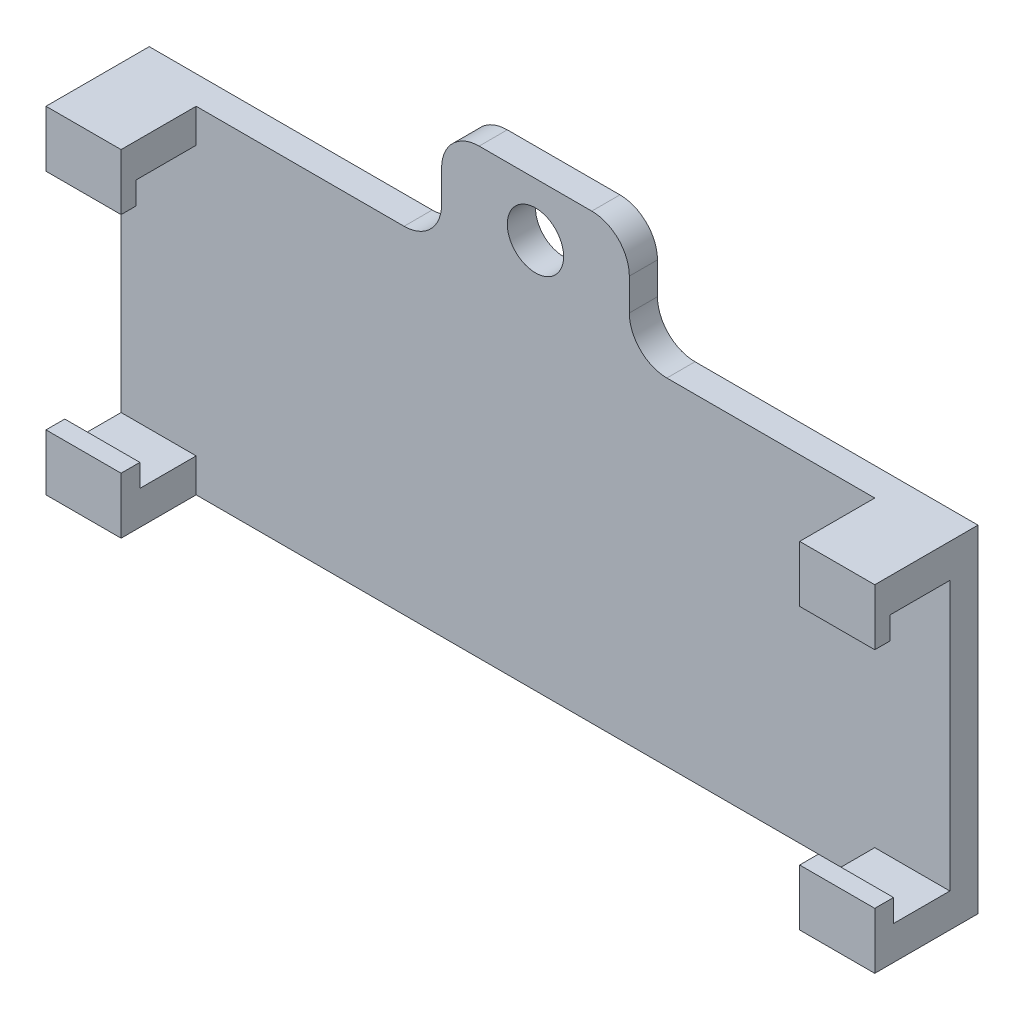
ISO-10303-21;
HEADER;
FILE_DESCRIPTION(('STEP AP214'),'2;1');
FILE_NAME('part.step','',(''),(''),'','','');
FILE_SCHEMA(('AUTOMOTIVE_DESIGN { 1 0 10303 214 1 1 1 1 }'));
ENDSEC;
DATA;
#1=APPLICATION_CONTEXT('core data for automotive mechanical design processes');
#2=APPLICATION_PROTOCOL_DEFINITION('international standard','automotive_design',2000,#1);
#3=PRODUCT_CONTEXT('',#1,'mechanical');
#4=PRODUCT('Part','Part','',(#3));
#5=PRODUCT_RELATED_PRODUCT_CATEGORY('part','',(#4));
#6=PRODUCT_DEFINITION_FORMATION('','',#4);
#7=PRODUCT_DEFINITION_CONTEXT('part definition',#1,'design');
#8=PRODUCT_DEFINITION('design','',#6,#7);
#9=PRODUCT_DEFINITION_SHAPE('','',#8);
#10=(LENGTH_UNIT() NAMED_UNIT(*) SI_UNIT(.MILLI.,.METRE.));
#11=(NAMED_UNIT(*) PLANE_ANGLE_UNIT() SI_UNIT($,.RADIAN.));
#12=(NAMED_UNIT(*) SI_UNIT($,.STERADIAN.) SOLID_ANGLE_UNIT());
#13=UNCERTAINTY_MEASURE_WITH_UNIT(LENGTH_MEASURE(1.E-05),#10,'distance_accuracy_value','');
#14=(GEOMETRIC_REPRESENTATION_CONTEXT(3) GLOBAL_UNCERTAINTY_ASSIGNED_CONTEXT((#13)) GLOBAL_UNIT_ASSIGNED_CONTEXT((#10,
#11,#12)) REPRESENTATION_CONTEXT('',''));
#15=CARTESIAN_POINT('',(0.,0.,0.));
#16=DIRECTION('',(0.,0.,1.));
#17=DIRECTION('',(1.,0.,0.));
#18=AXIS2_PLACEMENT_3D('',#15,#16,#17);
#19=CARTESIAN_POINT('',(0.,2.67999999999999,-17.95));
#20=DIRECTION('',(0.,1.,0.));
#21=DIRECTION('',(-1.,0.,0.));
#22=AXIS2_PLACEMENT_3D('',#19,#20,#21);
#23=PLANE('',#22);
#24=DIRECTION('',(-1.,0.,0.));
#25=VECTOR('',#24,1.);
#26=CARTESIAN_POINT('',(0.,2.67999999999999,-18.75));
#27=LINE('',#26,#25);
#28=CARTESIAN_POINT('',(4.,2.67999999999999,-18.75));
#29=VERTEX_POINT('',#28);
#30=CARTESIAN_POINT('',(0.,2.67999999999999,-18.75));
#31=VERTEX_POINT('',#30);
#32=EDGE_CURVE('E445',#29,#31,#27,.T.);
#33=ORIENTED_EDGE('',*,*,#32,.F.);
#34=DIRECTION('',(0.,0.,1.));
#35=VECTOR('',#34,1.);
#36=CARTESIAN_POINT('',(4.,2.67999999999999,-17.95));
#37=LINE('',#36,#35);
#38=CARTESIAN_POINT('',(4.,2.67999999999999,-17.95));
#39=VERTEX_POINT('',#38);
#40=EDGE_CURVE('E411',#29,#39,#37,.T.);
#41=ORIENTED_EDGE('',*,*,#40,.T.);
#42=DIRECTION('',(1.,0.,0.));
#43=VECTOR('',#42,1.);
#44=CARTESIAN_POINT('',(0.,2.67999999999999,-17.95));
#45=LINE('',#44,#43);
#46=CARTESIAN_POINT('',(0.,2.67999999999999,-17.95));
#47=VERTEX_POINT('',#46);
#48=EDGE_CURVE('E493',#47,#39,#45,.T.);
#49=ORIENTED_EDGE('',*,*,#48,.F.);
#50=DIRECTION('',(0.,0.,-1.));
#51=VECTOR('',#50,1.);
#52=CARTESIAN_POINT('',(0.,2.67999999999999,-17.95));
#53=LINE('',#52,#51);
#54=EDGE_CURVE('E281',#47,#31,#53,.T.);
#55=ORIENTED_EDGE('',*,*,#54,.T.);
#56=EDGE_LOOP('',(#33,#41,#49,#55));
#57=FACE_BOUND('',#56,.T.);
#58=ADVANCED_FACE('F39',(#57),#23,.F.);
#59=CARTESIAN_POINT('',(0.,5.67999999999999,-17.95));
#60=DIRECTION('',(0.,-1.,0.));
#61=DIRECTION('',(1.,0.,0.));
#62=AXIS2_PLACEMENT_3D('',#59,#60,#61);
#63=PLANE('',#62);
#64=DIRECTION('',(1.,0.,0.));
#65=VECTOR('',#64,1.);
#66=CARTESIAN_POINT('',(0.,5.68,-21.95));
#67=LINE('',#66,#65);
#68=CARTESIAN_POINT('',(4.,5.68,-21.95));
#69=VERTEX_POINT('',#68);
#70=CARTESIAN_POINT('',(15.075,5.68,-21.95));
#71=VERTEX_POINT('',#70);
#72=EDGE_CURVE('E353',#69,#71,#67,.T.);
#73=ORIENTED_EDGE('',*,*,#72,.T.);
#74=DIRECTION('',(0.,0.,1.));
#75=VECTOR('',#74,1.);
#76=CARTESIAN_POINT('',(15.075,5.68000000000001,-23.45));
#77=LINE('',#76,#75);
#78=CARTESIAN_POINT('',(15.075,5.68000000000001,-23.45));
#79=VERTEX_POINT('',#78);
#80=EDGE_CURVE('E268',#71,#79,#77,.F.);
#81=ORIENTED_EDGE('',*,*,#80,.T.);
#82=DIRECTION('',(1.,0.,0.));
#83=VECTOR('',#82,1.);
#84=CARTESIAN_POINT('',(0.,5.68000000000001,-23.45));
#85=LINE('',#84,#83);
#86=CARTESIAN_POINT('',(0.,5.68000000000001,-23.45));
#87=VERTEX_POINT('',#86);
#88=EDGE_CURVE('E264',#87,#79,#85,.T.);
#89=ORIENTED_EDGE('',*,*,#88,.F.);
#90=DIRECTION('',(0.,0.,-1.));
#91=VECTOR('',#90,1.);
#92=CARTESIAN_POINT('',(0.,5.67999999999999,-17.95));
#93=LINE('',#92,#91);
#94=CARTESIAN_POINT('',(0.,5.67999999999999,-17.95));
#95=VERTEX_POINT('',#94);
#96=EDGE_CURVE('E248',#95,#87,#93,.T.);
#97=ORIENTED_EDGE('',*,*,#96,.F.);
#98=DIRECTION('',(-1.,0.,0.));
#99=VECTOR('',#98,1.);
#100=CARTESIAN_POINT('',(0.,5.67999999999999,-17.95));
#101=LINE('',#100,#99);
#102=CARTESIAN_POINT('',(4.,5.67999999999999,-17.95));
#103=VERTEX_POINT('',#102);
#104=EDGE_CURVE('E498',#103,#95,#101,.T.);
#105=ORIENTED_EDGE('',*,*,#104,.F.);
#106=DIRECTION('',(0.,0.,-1.));
#107=VECTOR('',#106,1.);
#108=CARTESIAN_POINT('',(4.,5.67999999999999,-17.95));
#109=LINE('',#108,#107);
#110=EDGE_CURVE('E414',#103,#69,#109,.T.);
#111=ORIENTED_EDGE('',*,*,#110,.T.);
#112=EDGE_LOOP('',(#73,#81,#89,#97,#105,#111));
#113=FACE_BOUND('',#112,.T.);
#114=ADVANCED_FACE('F266',(#113),#63,.F.);
#115=CARTESIAN_POINT('',(0.,-17.95,-17.9500000000001));
#116=DIRECTION('',(0.,0.,-1.));
#117=DIRECTION('',(0.,1.,0.));
#118=AXIS2_PLACEMENT_3D('',#115,#116,#117);
#119=PLANE('',#118);
#120=ORIENTED_EDGE('',*,*,#48,.T.);
#121=DIRECTION('',(0.,-1.,0.));
#122=VECTOR('',#121,1.);
#123=CARTESIAN_POINT('',(4.,11.38,-17.95));
#124=LINE('',#123,#122);
#125=EDGE_CURVE('E372',#103,#39,#124,.T.);
#126=ORIENTED_EDGE('',*,*,#125,.F.);
#127=ORIENTED_EDGE('',*,*,#104,.T.);
#128=DIRECTION('',(0.,-1.,0.));
#129=VECTOR('',#128,1.);
#130=CARTESIAN_POINT('',(0.,2.67999999999999,-17.95));
#131=LINE('',#130,#129);
#132=EDGE_CURVE('E257',#95,#47,#131,.T.);
#133=ORIENTED_EDGE('',*,*,#132,.T.);
#134=EDGE_LOOP('',(#120,#126,#127,#133));
#135=FACE_BOUND('',#134,.T.);
#136=ADVANCED_FACE('F538',(#135),#119,.F.);
#137=CARTESIAN_POINT('',(0.,-9.25000000000001,-17.95));
#138=DIRECTION('',(0.,-1.,0.));
#139=DIRECTION('',(1.,0.,0.));
#140=AXIS2_PLACEMENT_3D('',#137,#138,#139);
#141=PLANE('',#140);
#142=DIRECTION('',(-1.,0.,0.));
#143=VECTOR('',#142,1.);
#144=CARTESIAN_POINT('',(0.,-9.25000000000001,-17.95));
#145=LINE('',#144,#143);
#146=CARTESIAN_POINT('',(4.,-9.25000000000001,-17.95));
#147=VERTEX_POINT('',#146);
#148=CARTESIAN_POINT('',(0.,-9.25000000000001,-17.95));
#149=VERTEX_POINT('',#148);
#150=EDGE_CURVE('E477',#147,#149,#145,.T.);
#151=ORIENTED_EDGE('',*,*,#150,.F.);
#152=DIRECTION('',(0.,0.,-1.));
#153=VECTOR('',#152,1.);
#154=CARTESIAN_POINT('',(4.,-9.25000000000001,-17.95));
#155=LINE('',#154,#153);
#156=CARTESIAN_POINT('',(4.,-9.25,-18.95));
#157=VERTEX_POINT('',#156);
#158=EDGE_CURVE('E402',#147,#157,#155,.T.);
#159=ORIENTED_EDGE('',*,*,#158,.T.);
#160=DIRECTION('',(1.,0.,0.));
#161=VECTOR('',#160,1.);
#162=CARTESIAN_POINT('',(44.15,-9.25,-18.95));
#163=LINE('',#162,#161);
#164=CARTESIAN_POINT('',(0.,-9.25,-18.95));
#165=VERTEX_POINT('',#164);
#166=EDGE_CURVE('E429',#165,#157,#163,.T.);
#167=ORIENTED_EDGE('',*,*,#166,.F.);
#168=DIRECTION('',(0.,0.,-1.));
#169=VECTOR('',#168,1.);
#170=CARTESIAN_POINT('',(0.,-9.25000000000001,-17.95));
#171=LINE('',#170,#169);
#172=EDGE_CURVE('E481',#149,#165,#171,.T.);
#173=ORIENTED_EDGE('',*,*,#172,.F.);
#174=EDGE_LOOP('',(#151,#159,#167,#173));
#175=FACE_BOUND('',#174,.T.);
#176=ADVANCED_FACE('F563',(#175),#141,.F.);
#177=CARTESIAN_POINT('',(0.,-17.95,-17.9500000000001));
#178=DIRECTION('',(0.,0.,1.));
#179=DIRECTION('',(0.,-1.,0.));
#180=AXIS2_PLACEMENT_3D('',#177,#178,#179);
#181=PLANE('',#180);
#182=CARTESIAN_POINT('',(4.,-12.25,-17.9500000000001));
#183=VERTEX_POINT('',#182);
#184=EDGE_CURVE('E370',#147,#183,#124,.T.);
#185=ORIENTED_EDGE('',*,*,#184,.F.);
#186=ORIENTED_EDGE('',*,*,#150,.T.);
#187=DIRECTION('',(0.,-1.,0.));
#188=VECTOR('',#187,1.);
#189=CARTESIAN_POINT('',(0.,-9.25000000000001,-17.95));
#190=LINE('',#189,#188);
#191=CARTESIAN_POINT('',(0.,-12.25,-17.9500000000001));
#192=VERTEX_POINT('',#191);
#193=EDGE_CURVE('E467',#149,#192,#190,.T.);
#194=ORIENTED_EDGE('',*,*,#193,.T.);
#195=DIRECTION('',(1.,0.,0.));
#196=VECTOR('',#195,1.);
#197=CARTESIAN_POINT('',(0.,-12.25,-17.9500000000001));
#198=LINE('',#197,#196);
#199=EDGE_CURVE('E472',#192,#183,#198,.T.);
#200=ORIENTED_EDGE('',*,*,#199,.T.);
#201=EDGE_LOOP('',(#185,#186,#194,#200));
#202=FACE_BOUND('',#201,.T.);
#203=ADVANCED_FACE('F567',(#202),#181,.T.);
#204=CARTESIAN_POINT('',(0.,3.87999999999999,-18.75));
#205=DIRECTION('',(0.,0.,1.));
#206=DIRECTION('',(0.,-1.,0.));
#207=AXIS2_PLACEMENT_3D('',#204,#205,#206);
#208=PLANE('',#207);
#209=DIRECTION('',(-1.,0.,0.));
#210=VECTOR('',#209,1.);
#211=CARTESIAN_POINT('',(0.,3.87999999999999,-18.75));
#212=LINE('',#211,#210);
#213=CARTESIAN_POINT('',(4.,3.87999999999999,-18.75));
#214=VERTEX_POINT('',#213);
#215=CARTESIAN_POINT('',(0.,3.87999999999999,-18.75));
#216=VERTEX_POINT('',#215);
#217=EDGE_CURVE('E457',#214,#216,#212,.T.);
#218=ORIENTED_EDGE('',*,*,#217,.F.);
#219=DIRECTION('',(0.,-1.,0.));
#220=VECTOR('',#219,1.);
#221=CARTESIAN_POINT('',(4.,3.87999999999999,-18.75));
#222=LINE('',#221,#220);
#223=EDGE_CURVE('E408',#214,#29,#222,.T.);
#224=ORIENTED_EDGE('',*,*,#223,.T.);
#225=ORIENTED_EDGE('',*,*,#32,.T.);
#226=DIRECTION('',(0.,-1.,0.));
#227=VECTOR('',#226,1.);
#228=CARTESIAN_POINT('',(0.,3.87999999999999,-18.75));
#229=LINE('',#228,#227);
#230=EDGE_CURVE('E464',#216,#31,#229,.T.);
#231=ORIENTED_EDGE('',*,*,#230,.F.);
#232=EDGE_LOOP('',(#218,#224,#225,#231));
#233=FACE_BOUND('',#232,.T.);
#234=ADVANCED_FACE('F543',(#233),#208,.F.);
#235=CARTESIAN_POINT('',(0.,3.88000000000001,-23.45));
#236=DIRECTION('',(0.,1.,0.));
#237=DIRECTION('',(-1.,0.,0.));
#238=AXIS2_PLACEMENT_3D('',#235,#236,#237);
#239=PLANE('',#238);
#240=DIRECTION('',(1.,0.,0.));
#241=VECTOR('',#240,1.);
#242=CARTESIAN_POINT('',(0.,3.88,-21.95));
#243=LINE('',#242,#241);
#244=CARTESIAN_POINT('',(0.,3.88,-21.95));
#245=VERTEX_POINT('',#244);
#246=CARTESIAN_POINT('',(4.,3.88,-21.95));
#247=VERTEX_POINT('',#246);
#248=EDGE_CURVE('E452',#245,#247,#243,.T.);
#249=ORIENTED_EDGE('',*,*,#248,.T.);
#250=DIRECTION('',(0.,0.,1.));
#251=VECTOR('',#250,1.);
#252=CARTESIAN_POINT('',(4.,3.88000000000001,-23.45));
#253=LINE('',#252,#251);
#254=EDGE_CURVE('E405',#247,#214,#253,.T.);
#255=ORIENTED_EDGE('',*,*,#254,.T.);
#256=ORIENTED_EDGE('',*,*,#217,.T.);
#257=DIRECTION('',(0.,0.,-1.));
#258=VECTOR('',#257,1.);
#259=CARTESIAN_POINT('',(0.,3.88,-21.95));
#260=LINE('',#259,#258);
#261=EDGE_CURVE('E447',#216,#245,#260,.T.);
#262=ORIENTED_EDGE('',*,*,#261,.T.);
#263=EDGE_LOOP('',(#249,#255,#256,#262));
#264=FACE_BOUND('',#263,.T.);
#265=ADVANCED_FACE('F547',(#264),#239,.F.);
#266=CARTESIAN_POINT('',(44.15,-10.45,-18.95));
#267=DIRECTION('',(0.,0.,1.));
#268=DIRECTION('',(0.,-1.,0.));
#269=AXIS2_PLACEMENT_3D('',#266,#267,#268);
#270=PLANE('',#269);
#271=ORIENTED_EDGE('',*,*,#166,.T.);
#272=DIRECTION('',(0.,-1.,0.));
#273=VECTOR('',#272,1.);
#274=CARTESIAN_POINT('',(4.,-10.45,-18.95));
#275=LINE('',#274,#273);
#276=CARTESIAN_POINT('',(4.,-10.45,-18.95));
#277=VERTEX_POINT('',#276);
#278=EDGE_CURVE('E399',#157,#277,#275,.T.);
#279=ORIENTED_EDGE('',*,*,#278,.T.);
#280=DIRECTION('',(1.,0.,0.));
#281=VECTOR('',#280,1.);
#282=CARTESIAN_POINT('',(44.15,-10.45,-18.95));
#283=LINE('',#282,#281);
#284=CARTESIAN_POINT('',(0.,-10.45,-18.95));
#285=VERTEX_POINT('',#284);
#286=EDGE_CURVE('E436',#285,#277,#283,.T.);
#287=ORIENTED_EDGE('',*,*,#286,.F.);
#288=DIRECTION('',(0.,1.,0.));
#289=VECTOR('',#288,1.);
#290=CARTESIAN_POINT('',(0.,-10.45,-18.95));
#291=LINE('',#290,#289);
#292=EDGE_CURVE('E439',#285,#165,#291,.T.);
#293=ORIENTED_EDGE('',*,*,#292,.T.);
#294=EDGE_LOOP('',(#271,#279,#287,#293));
#295=FACE_BOUND('',#294,.T.);
#296=ADVANCED_FACE('F556',(#295),#270,.F.);
#297=CARTESIAN_POINT('',(0.,-10.45,-23.45));
#298=DIRECTION('',(0.,-1.,0.));
#299=DIRECTION('',(1.,0.,0.));
#300=AXIS2_PLACEMENT_3D('',#297,#298,#299);
#301=PLANE('',#300);
#302=ORIENTED_EDGE('',*,*,#286,.T.);
#303=DIRECTION('',(0.,0.,-1.));
#304=VECTOR('',#303,1.);
#305=CARTESIAN_POINT('',(4.,-10.45,-23.45));
#306=LINE('',#305,#304);
#307=CARTESIAN_POINT('',(4.,-10.45,-21.95));
#308=VERTEX_POINT('',#307);
#309=EDGE_CURVE('E299',#277,#308,#306,.T.);
#310=ORIENTED_EDGE('',*,*,#309,.T.);
#311=DIRECTION('',(-1.,0.,0.));
#312=VECTOR('',#311,1.);
#313=CARTESIAN_POINT('',(44.15,-10.45,-21.95));
#314=LINE('',#313,#312);
#315=CARTESIAN_POINT('',(0.,-10.45,-21.95));
#316=VERTEX_POINT('',#315);
#317=EDGE_CURVE('E428',#308,#316,#314,.T.);
#318=ORIENTED_EDGE('',*,*,#317,.T.);
#319=DIRECTION('',(0.,0.,1.));
#320=VECTOR('',#319,1.);
#321=CARTESIAN_POINT('',(0.,-10.45,-21.95));
#322=LINE('',#321,#320);
#323=EDGE_CURVE('E433',#316,#285,#322,.T.);
#324=ORIENTED_EDGE('',*,*,#323,.T.);
#325=EDGE_LOOP('',(#302,#310,#318,#324));
#326=FACE_BOUND('',#325,.T.);
#327=ADVANCED_FACE('F554',(#326),#301,.F.);
#328=CARTESIAN_POINT('',(0.,-17.95,-21.9500000000001));
#329=DIRECTION('',(1.,0.,0.));
#330=DIRECTION('',(0.,1.,0.));
#331=AXIS2_PLACEMENT_3D('',#328,#329,#330);
#332=PLANE('',#331);
#333=ORIENTED_EDGE('',*,*,#96,.T.);
#334=DIRECTION('',(0.,-1.,0.));
#335=VECTOR('',#334,1.);
#336=CARTESIAN_POINT('',(0.,-17.95,-23.4500000000001));
#337=LINE('',#336,#335);
#338=CARTESIAN_POINT('',(0.,-12.25,-23.4500000000001));
#339=VERTEX_POINT('',#338);
#340=EDGE_CURVE('E253',#87,#339,#337,.T.);
#341=ORIENTED_EDGE('',*,*,#340,.T.);
#342=DIRECTION('',(0.,0.,-1.));
#343=VECTOR('',#342,1.);
#344=CARTESIAN_POINT('',(0.,-12.25,-17.9500000000001));
#345=LINE('',#344,#343);
#346=EDGE_CURVE('E489',#192,#339,#345,.T.);
#347=ORIENTED_EDGE('',*,*,#346,.F.);
#348=ORIENTED_EDGE('',*,*,#193,.F.);
#349=ORIENTED_EDGE('',*,*,#172,.T.);
#350=ORIENTED_EDGE('',*,*,#292,.F.);
#351=ORIENTED_EDGE('',*,*,#323,.F.);
#352=DIRECTION('',(0.,-1.,0.));
#353=VECTOR('',#352,1.);
#354=CARTESIAN_POINT('',(0.,-17.95,-21.9500000000001));
#355=LINE('',#354,#353);
#356=EDGE_CURVE('E295',#245,#316,#355,.T.);
#357=ORIENTED_EDGE('',*,*,#356,.F.);
#358=ORIENTED_EDGE('',*,*,#261,.F.);
#359=ORIENTED_EDGE('',*,*,#230,.T.);
#360=ORIENTED_EDGE('',*,*,#54,.F.);
#361=ORIENTED_EDGE('',*,*,#132,.F.);
#362=EDGE_LOOP('',(#333,#341,#347,#348,#349,#350,#351,#357,#358,#359,#360,#361));
#363=FACE_BOUND('',#362,.T.);
#364=ADVANCED_FACE('F250',(#363),#332,.F.);
#365=CARTESIAN_POINT('',(44.15,-17.95,-21.9500000000001));
#366=DIRECTION('',(-1.,0.,0.));
#367=DIRECTION('',(0.,-1.,0.));
#368=AXIS2_PLACEMENT_3D('',#365,#366,#367);
#369=PLANE('',#368);
#370=DIRECTION('',(0.,1.,0.));
#371=VECTOR('',#370,1.);
#372=CARTESIAN_POINT('',(44.15,-17.95,-23.4500000000001));
#373=LINE('',#372,#371);
#374=CARTESIAN_POINT('',(44.15,-12.25,-23.4500000000001));
#375=VERTEX_POINT('',#374);
#376=CARTESIAN_POINT('',(44.15,5.68000000000002,-23.45));
#377=VERTEX_POINT('',#376);
#378=EDGE_CURVE('E280',#375,#377,#373,.T.);
#379=ORIENTED_EDGE('',*,*,#378,.T.);
#380=DIRECTION('',(0.,0.,-1.));
#381=VECTOR('',#380,1.);
#382=CARTESIAN_POINT('',(44.15,5.67999999999999,-17.95));
#383=LINE('',#382,#381);
#384=CARTESIAN_POINT('',(44.15,5.67999999999999,-17.95));
#385=VERTEX_POINT('',#384);
#386=EDGE_CURVE('E260',#385,#377,#383,.T.);
#387=ORIENTED_EDGE('',*,*,#386,.F.);
#388=DIRECTION('',(0.,1.,0.));
#389=VECTOR('',#388,1.);
#390=CARTESIAN_POINT('',(44.15,2.67999999999999,-17.95));
#391=LINE('',#390,#389);
#392=CARTESIAN_POINT('',(44.15,2.67999999999999,-17.95));
#393=VERTEX_POINT('',#392);
#394=EDGE_CURVE('E496',#393,#385,#391,.T.);
#395=ORIENTED_EDGE('',*,*,#394,.F.);
#396=DIRECTION('',(0.,0.,-1.));
#397=VECTOR('',#396,1.);
#398=CARTESIAN_POINT('',(44.15,2.67999999999999,-17.95));
#399=LINE('',#398,#397);
#400=CARTESIAN_POINT('',(44.15,2.67999999999999,-18.75));
#401=VERTEX_POINT('',#400);
#402=EDGE_CURVE('E287',#393,#401,#399,.T.);
#403=ORIENTED_EDGE('',*,*,#402,.T.);
#404=DIRECTION('',(0.,-1.,0.));
#405=VECTOR('',#404,1.);
#406=CARTESIAN_POINT('',(44.15,3.87999999999999,-18.75));
#407=LINE('',#406,#405);
#408=CARTESIAN_POINT('',(44.15,3.87999999999999,-18.75));
#409=VERTEX_POINT('',#408);
#410=EDGE_CURVE('E461',#409,#401,#407,.T.);
#411=ORIENTED_EDGE('',*,*,#410,.F.);
#412=DIRECTION('',(0.,0.,1.));
#413=VECTOR('',#412,1.);
#414=CARTESIAN_POINT('',(44.15,3.88,-21.95));
#415=LINE('',#414,#413);
#416=CARTESIAN_POINT('',(44.15,3.88,-21.95));
#417=VERTEX_POINT('',#416);
#418=EDGE_CURVE('E455',#417,#409,#415,.T.);
#419=ORIENTED_EDGE('',*,*,#418,.F.);
#420=DIRECTION('',(0.,1.,0.));
#421=VECTOR('',#420,1.);
#422=CARTESIAN_POINT('',(44.15,-17.95,-21.9500000000001));
#423=LINE('',#422,#421);
#424=CARTESIAN_POINT('',(44.15,-10.45,-21.95));
#425=VERTEX_POINT('',#424);
#426=EDGE_CURVE('E505',#425,#417,#423,.T.);
#427=ORIENTED_EDGE('',*,*,#426,.F.);
#428=DIRECTION('',(0.,0.,-1.));
#429=VECTOR('',#428,1.);
#430=CARTESIAN_POINT('',(44.15,-10.45,-21.95));
#431=LINE('',#430,#429);
#432=CARTESIAN_POINT('',(44.15,-10.45,-18.95));
#433=VERTEX_POINT('',#432);
#434=EDGE_CURVE('E425',#433,#425,#431,.T.);
#435=ORIENTED_EDGE('',*,*,#434,.F.);
#436=DIRECTION('',(0.,1.,0.));
#437=VECTOR('',#436,1.);
#438=CARTESIAN_POINT('',(44.15,-10.45,-18.95));
#439=LINE('',#438,#437);
#440=CARTESIAN_POINT('',(44.15,-9.25,-18.95));
#441=VERTEX_POINT('',#440);
#442=EDGE_CURVE('E442',#433,#441,#439,.T.);
#443=ORIENTED_EDGE('',*,*,#442,.T.);
#444=DIRECTION('',(0.,0.,-1.));
#445=VECTOR('',#444,1.);
#446=CARTESIAN_POINT('',(44.15,-9.25000000000001,-17.95));
#447=LINE('',#446,#445);
#448=CARTESIAN_POINT('',(44.15,-9.25000000000001,-17.95));
#449=VERTEX_POINT('',#448);
#450=EDGE_CURVE('E484',#449,#441,#447,.T.);
#451=ORIENTED_EDGE('',*,*,#450,.F.);
#452=DIRECTION('',(0.,1.,0.));
#453=VECTOR('',#452,1.);
#454=CARTESIAN_POINT('',(44.15,-9.25000000000001,-17.95));
#455=LINE('',#454,#453);
#456=CARTESIAN_POINT('',(44.15,-12.25,-17.9500000000001));
#457=VERTEX_POINT('',#456);
#458=EDGE_CURVE('E475',#457,#449,#455,.T.);
#459=ORIENTED_EDGE('',*,*,#458,.F.);
#460=DIRECTION('',(0.,0.,-1.));
#461=VECTOR('',#460,1.);
#462=CARTESIAN_POINT('',(44.15,-12.25,-17.9500000000001));
#463=LINE('',#462,#461);
#464=EDGE_CURVE('E487',#457,#375,#463,.T.);
#465=ORIENTED_EDGE('',*,*,#464,.T.);
#466=EDGE_LOOP('',(#379,#387,#395,#403,#411,#419,#427,#435,#443,#451,#459,#465));
#467=FACE_BOUND('',#466,.T.);
#468=ADVANCED_FACE('F583',(#467),#369,.F.);
#469=CARTESIAN_POINT('',(0.,-17.95,-23.4500000000001));
#470=DIRECTION('',(0.,0.,-1.));
#471=DIRECTION('',(0.,1.,0.));
#472=AXIS2_PLACEMENT_3D('',#469,#470,#471);
#473=PLANE('',#472);
#474=DIRECTION('',(0.,1.,0.));
#475=VECTOR('',#474,1.);
#476=CARTESIAN_POINT('',(17.075,11.38,-23.45));
#477=LINE('',#476,#475);
#478=CARTESIAN_POINT('',(17.075,7.68000000000001,-23.45));
#479=VERTEX_POINT('',#478);
#480=CARTESIAN_POINT('',(17.075,9.38000000000001,-23.45));
#481=VERTEX_POINT('',#480);
#482=EDGE_CURVE('E270',#479,#481,#477,.T.);
#483=ORIENTED_EDGE('',*,*,#482,.T.);
#484=CARTESIAN_POINT('',(19.075,9.38000000000001,-23.45));
#485=DIRECTION('',(0.,0.,-1.));
#486=DIRECTION('',(0.,1.,0.));
#487=AXIS2_PLACEMENT_3D('',#484,#485,#486);
#488=CIRCLE('',#487,2.);
#489=CARTESIAN_POINT('',(19.075,11.38,-23.45));
#490=VERTEX_POINT('',#489);
#491=EDGE_CURVE('E319',#481,#490,#488,.T.);
#492=ORIENTED_EDGE('',*,*,#491,.T.);
#493=DIRECTION('',(-1.,0.,0.));
#494=VECTOR('',#493,1.);
#495=CARTESIAN_POINT('',(0.,11.38,-23.45));
#496=LINE('',#495,#494);
#497=CARTESIAN_POINT('',(25.075,11.38,-23.45));
#498=VERTEX_POINT('',#497);
#499=EDGE_CURVE('E284',#498,#490,#496,.T.);
#500=ORIENTED_EDGE('',*,*,#499,.F.);
#501=CARTESIAN_POINT('',(25.075,9.38000000000001,-23.45));
#502=DIRECTION('',(0.,0.,-1.));
#503=DIRECTION('',(0.,1.,0.));
#504=AXIS2_PLACEMENT_3D('',#501,#502,#503);
#505=CIRCLE('',#504,2.);
#506=CARTESIAN_POINT('',(27.075,9.38000000000001,-23.45));
#507=VERTEX_POINT('',#506);
#508=EDGE_CURVE('E317',#498,#507,#505,.T.);
#509=ORIENTED_EDGE('',*,*,#508,.T.);
#510=DIRECTION('',(0.,-1.,0.));
#511=VECTOR('',#510,1.);
#512=CARTESIAN_POINT('',(27.075,11.38,-23.45));
#513=LINE('',#512,#511);
#514=CARTESIAN_POINT('',(27.075,7.68000000000001,-23.45));
#515=VERTEX_POINT('',#514);
#516=EDGE_CURVE('E354',#507,#515,#513,.T.);
#517=ORIENTED_EDGE('',*,*,#516,.T.);
#518=CARTESIAN_POINT('',(29.075,7.68000000000001,-23.45));
#519=DIRECTION('',(0.,0.,-1.));
#520=DIRECTION('',(0.,1.,0.));
#521=AXIS2_PLACEMENT_3D('',#518,#519,#520);
#522=CIRCLE('',#521,2.);
#523=CARTESIAN_POINT('',(29.075,5.68000000000001,-23.45));
#524=VERTEX_POINT('',#523);
#525=EDGE_CURVE('E12',#515,#524,#522,.F.);
#526=ORIENTED_EDGE('',*,*,#525,.T.);
#527=DIRECTION('',(1.,0.,0.));
#528=VECTOR('',#527,1.);
#529=CARTESIAN_POINT('',(44.15,5.68000000000002,-23.45));
#530=LINE('',#529,#528);
#531=EDGE_CURVE('E350',#524,#377,#530,.T.);
#532=ORIENTED_EDGE('',*,*,#531,.T.);
#533=ORIENTED_EDGE('',*,*,#378,.F.);
#534=DIRECTION('',(-1.,0.,0.));
#535=VECTOR('',#534,1.);
#536=CARTESIAN_POINT('',(0.,-12.25,-23.4500000000001));
#537=LINE('',#536,#535);
#538=EDGE_CURVE('E279',#375,#339,#537,.T.);
#539=ORIENTED_EDGE('',*,*,#538,.T.);
#540=ORIENTED_EDGE('',*,*,#340,.F.);
#541=ORIENTED_EDGE('',*,*,#88,.T.);
#542=CARTESIAN_POINT('',(15.075,7.68000000000001,-23.45));
#543=DIRECTION('',(0.,0.,-1.));
#544=DIRECTION('',(0.,1.,0.));
#545=AXIS2_PLACEMENT_3D('',#542,#543,#544);
#546=CIRCLE('',#545,2.);
#547=EDGE_CURVE('E330',#79,#479,#546,.F.);
#548=ORIENTED_EDGE('',*,*,#547,.T.);
#549=EDGE_LOOP('',(#483,#492,#500,#509,#517,#526,#532,#533,#539,#540,#541,#548));
#550=FACE_BOUND('',#549,.T.);
#551=CARTESIAN_POINT('',(22.075,8.53000000000001,-23.45));
#552=DIRECTION('',(0.,0.,1.));
#553=DIRECTION('',(0.,-1.,0.));
#554=AXIS2_PLACEMENT_3D('',#551,#552,#553);
#555=CIRCLE('',#554,1.5);
#556=CARTESIAN_POINT('',(22.075,7.03000000000001,-23.45));
#557=VERTEX_POINT('',#556);
#558=EDGE_CURVE('E419',#557,#557,#555,.T.);
#559=ORIENTED_EDGE('',*,*,#558,.T.);
#560=EDGE_LOOP('',(#559));
#561=FACE_BOUND('',#560,.T.);
#562=ADVANCED_FACE('F275',(#550,#561),#473,.T.);
#563=CARTESIAN_POINT('',(0.,-17.95,-21.9500000000001));
#564=DIRECTION('',(0.,0.,-1.));
#565=DIRECTION('',(0.,1.,0.));
#566=AXIS2_PLACEMENT_3D('',#563,#564,#565);
#567=PLANE('',#566);
#568=DIRECTION('',(-1.,0.,0.));
#569=VECTOR('',#568,1.);
#570=CARTESIAN_POINT('',(0.,11.38,-21.95));
#571=LINE('',#570,#569);
#572=CARTESIAN_POINT('',(25.075,11.38,-21.95));
#573=VERTEX_POINT('',#572);
#574=CARTESIAN_POINT('',(19.075,11.38,-21.95));
#575=VERTEX_POINT('',#574);
#576=EDGE_CURVE('E290',#573,#575,#571,.T.);
#577=ORIENTED_EDGE('',*,*,#576,.T.);
#578=CARTESIAN_POINT('',(19.075,9.38000000000001,-21.95));
#579=DIRECTION('',(0.,0.,-1.));
#580=DIRECTION('',(0.,1.,0.));
#581=AXIS2_PLACEMENT_3D('',#578,#579,#580);
#582=CIRCLE('',#581,2.);
#583=CARTESIAN_POINT('',(17.075,9.38000000000001,-21.95));
#584=VERTEX_POINT('',#583);
#585=EDGE_CURVE('E315',#575,#584,#582,.F.);
#586=ORIENTED_EDGE('',*,*,#585,.T.);
#587=DIRECTION('',(0.,1.,0.));
#588=VECTOR('',#587,1.);
#589=CARTESIAN_POINT('',(17.075,11.38,-21.95));
#590=LINE('',#589,#588);
#591=CARTESIAN_POINT('',(17.075,7.68000000000001,-21.95));
#592=VERTEX_POINT('',#591);
#593=EDGE_CURVE('E271',#592,#584,#590,.T.);
#594=ORIENTED_EDGE('',*,*,#593,.F.);
#595=CARTESIAN_POINT('',(15.075,7.68000000000001,-21.95));
#596=DIRECTION('',(0.,0.,-1.));
#597=DIRECTION('',(0.,1.,0.));
#598=AXIS2_PLACEMENT_3D('',#595,#596,#597);
#599=CIRCLE('',#598,2.);
#600=EDGE_CURVE('E328',#592,#71,#599,.T.);
#601=ORIENTED_EDGE('',*,*,#600,.T.);
#602=ORIENTED_EDGE('',*,*,#72,.F.);
#603=DIRECTION('',(0.,-1.,0.));
#604=VECTOR('',#603,1.);
#605=CARTESIAN_POINT('',(4.,11.38,-21.95));
#606=LINE('',#605,#604);
#607=EDGE_CURVE('E380',#69,#247,#606,.T.);
#608=ORIENTED_EDGE('',*,*,#607,.T.);
#609=ORIENTED_EDGE('',*,*,#248,.F.);
#610=ORIENTED_EDGE('',*,*,#356,.T.);
#611=ORIENTED_EDGE('',*,*,#317,.F.);
#612=CARTESIAN_POINT('',(4.,-12.25,-21.9500000000001));
#613=VERTEX_POINT('',#612);
#614=EDGE_CURVE('E369',#308,#613,#606,.T.);
#615=ORIENTED_EDGE('',*,*,#614,.T.);
#616=DIRECTION('',(1.,0.,0.));
#617=VECTOR('',#616,1.);
#618=CARTESIAN_POINT('',(4.,-12.25,-21.9500000000001));
#619=LINE('',#618,#617);
#620=CARTESIAN_POINT('',(40.15,-12.25,-21.95));
#621=VERTEX_POINT('',#620);
#622=EDGE_CURVE('E364',#613,#621,#619,.T.);
#623=ORIENTED_EDGE('',*,*,#622,.T.);
#624=DIRECTION('',(0.,-1.,0.));
#625=VECTOR('',#624,1.);
#626=CARTESIAN_POINT('',(40.15,11.38,-21.95));
#627=LINE('',#626,#625);
#628=CARTESIAN_POINT('',(40.15,-10.45,-21.95));
#629=VERTEX_POINT('',#628);
#630=EDGE_CURVE('E378',#629,#621,#627,.T.);
#631=ORIENTED_EDGE('',*,*,#630,.F.);
#632=EDGE_CURVE('E430',#425,#629,#314,.T.);
#633=ORIENTED_EDGE('',*,*,#632,.F.);
#634=ORIENTED_EDGE('',*,*,#426,.T.);
#635=CARTESIAN_POINT('',(40.15,3.88,-21.95));
#636=VERTEX_POINT('',#635);
#637=EDGE_CURVE('E450',#636,#417,#243,.T.);
#638=ORIENTED_EDGE('',*,*,#637,.F.);
#639=CARTESIAN_POINT('',(40.15,5.68,-21.95));
#640=VERTEX_POINT('',#639);
#641=EDGE_CURVE('E377',#640,#636,#627,.T.);
#642=ORIENTED_EDGE('',*,*,#641,.F.);
#643=DIRECTION('',(1.,0.,0.));
#644=VECTOR('',#643,1.);
#645=CARTESIAN_POINT('',(44.15,5.68000000000001,-21.95));
#646=LINE('',#645,#644);
#647=CARTESIAN_POINT('',(29.075,5.68,-21.95));
#648=VERTEX_POINT('',#647);
#649=EDGE_CURVE('E339',#648,#640,#646,.T.);
#650=ORIENTED_EDGE('',*,*,#649,.F.);
#651=CARTESIAN_POINT('',(29.075,7.68000000000001,-21.95));
#652=DIRECTION('',(0.,0.,-1.));
#653=DIRECTION('',(0.,1.,0.));
#654=AXIS2_PLACEMENT_3D('',#651,#652,#653);
#655=CIRCLE('',#654,2.);
#656=CARTESIAN_POINT('',(27.075,7.68000000000001,-21.95));
#657=VERTEX_POINT('',#656);
#658=EDGE_CURVE('E47',#648,#657,#655,.T.);
#659=ORIENTED_EDGE('',*,*,#658,.T.);
#660=DIRECTION('',(0.,-1.,0.));
#661=VECTOR('',#660,1.);
#662=CARTESIAN_POINT('',(27.075,11.38,-21.95));
#663=LINE('',#662,#661);
#664=CARTESIAN_POINT('',(27.075,9.38000000000001,-21.95));
#665=VERTEX_POINT('',#664);
#666=EDGE_CURVE('E337',#665,#657,#663,.T.);
#667=ORIENTED_EDGE('',*,*,#666,.F.);
#668=CARTESIAN_POINT('',(25.075,9.38000000000001,-21.95));
#669=DIRECTION('',(0.,0.,-1.));
#670=DIRECTION('',(0.,1.,0.));
#671=AXIS2_PLACEMENT_3D('',#668,#669,#670);
#672=CIRCLE('',#671,2.);
#673=EDGE_CURVE('E313',#665,#573,#672,.F.);
#674=ORIENTED_EDGE('',*,*,#673,.T.);
#675=EDGE_LOOP('',(#577,#586,#594,#601,#602,#608,#609,#610,#611,#615,#623,#631,#633,#634,#638,
#642,#650,#659,#667,#674));
#676=FACE_BOUND('',#675,.T.);
#677=CARTESIAN_POINT('',(22.075,8.53,-21.95));
#678=DIRECTION('',(0.,0.,1.));
#679=DIRECTION('',(0.,-1.,0.));
#680=AXIS2_PLACEMENT_3D('',#677,#678,#679);
#681=CIRCLE('',#680,1.5);
#682=CARTESIAN_POINT('',(22.075,7.03000000000001,-21.95));
#683=VERTEX_POINT('',#682);
#684=EDGE_CURVE('E418',#683,#683,#681,.T.);
#685=ORIENTED_EDGE('',*,*,#684,.F.);
#686=EDGE_LOOP('',(#685));
#687=FACE_BOUND('',#686,.T.);
#688=ADVANCED_FACE('F335',(#676,#687),#567,.F.);
#689=CARTESIAN_POINT('',(0.,11.38,-21.95));
#690=DIRECTION('',(0.,-1.,0.));
#691=DIRECTION('',(1.,0.,0.));
#692=AXIS2_PLACEMENT_3D('',#689,#690,#691);
#693=PLANE('',#692);
#694=ORIENTED_EDGE('',*,*,#499,.T.);
#695=DIRECTION('',(0.,0.,1.));
#696=VECTOR('',#695,1.);
#697=CARTESIAN_POINT('',(19.075,11.38,-21.95));
#698=LINE('',#697,#696);
#699=EDGE_CURVE('E310',#490,#575,#698,.T.);
#700=ORIENTED_EDGE('',*,*,#699,.T.);
#701=ORIENTED_EDGE('',*,*,#576,.F.);
#702=DIRECTION('',(0.,0.,1.));
#703=VECTOR('',#702,1.);
#704=CARTESIAN_POINT('',(25.075,11.38,-21.95));
#705=LINE('',#704,#703);
#706=EDGE_CURVE('E308',#573,#498,#705,.F.);
#707=ORIENTED_EDGE('',*,*,#706,.T.);
#708=EDGE_LOOP('',(#694,#700,#701,#707));
#709=FACE_BOUND('',#708,.T.);
#710=ADVANCED_FACE('F515',(#709),#693,.F.);
#711=CARTESIAN_POINT('',(40.15,2.67999999999999,-17.95));
#712=VERTEX_POINT('',#711);
#713=EDGE_CURVE('E492',#712,#393,#45,.T.);
#714=ORIENTED_EDGE('',*,*,#713,.F.);
#715=DIRECTION('',(0.,0.,-1.));
#716=VECTOR('',#715,1.);
#717=CARTESIAN_POINT('',(40.15,2.67999999999999,-17.95));
#718=LINE('',#717,#716);
#719=CARTESIAN_POINT('',(40.15,2.67999999999999,-18.75));
#720=VERTEX_POINT('',#719);
#721=EDGE_CURVE('E394',#712,#720,#718,.T.);
#722=ORIENTED_EDGE('',*,*,#721,.T.);
#723=EDGE_CURVE('E451',#401,#720,#27,.T.);
#724=ORIENTED_EDGE('',*,*,#723,.F.);
#725=ORIENTED_EDGE('',*,*,#402,.F.);
#726=EDGE_LOOP('',(#714,#722,#724,#725));
#727=FACE_BOUND('',#726,.T.);
#728=ADVANCED_FACE('F597',(#727),#23,.F.);
#729=ORIENTED_EDGE('',*,*,#531,.F.);
#730=DIRECTION('',(0.,0.,1.));
#731=VECTOR('',#730,1.);
#732=CARTESIAN_POINT('',(29.075,5.68,-21.95));
#733=LINE('',#732,#731);
#734=EDGE_CURVE('E325',#524,#648,#733,.T.);
#735=ORIENTED_EDGE('',*,*,#734,.T.);
#736=ORIENTED_EDGE('',*,*,#649,.T.);
#737=DIRECTION('',(0.,0.,1.));
#738=VECTOR('',#737,1.);
#739=CARTESIAN_POINT('',(40.15,5.67999999999999,-17.95));
#740=LINE('',#739,#738);
#741=CARTESIAN_POINT('',(40.15,5.67999999999999,-17.95));
#742=VERTEX_POINT('',#741);
#743=EDGE_CURVE('E397',#640,#742,#740,.T.);
#744=ORIENTED_EDGE('',*,*,#743,.T.);
#745=EDGE_CURVE('E261',#385,#742,#101,.T.);
#746=ORIENTED_EDGE('',*,*,#745,.F.);
#747=ORIENTED_EDGE('',*,*,#386,.T.);
#748=EDGE_LOOP('',(#729,#735,#736,#744,#746,#747));
#749=FACE_BOUND('',#748,.T.);
#750=ADVANCED_FACE('F346',(#749),#63,.F.);
#751=ORIENTED_EDGE('',*,*,#745,.T.);
#752=DIRECTION('',(0.,-1.,0.));
#753=VECTOR('',#752,1.);
#754=CARTESIAN_POINT('',(40.15,11.38,-17.95));
#755=LINE('',#754,#753);
#756=EDGE_CURVE('E373',#742,#712,#755,.T.);
#757=ORIENTED_EDGE('',*,*,#756,.T.);
#758=ORIENTED_EDGE('',*,*,#713,.T.);
#759=ORIENTED_EDGE('',*,*,#394,.T.);
#760=EDGE_LOOP('',(#751,#757,#758,#759));
#761=FACE_BOUND('',#760,.T.);
#762=ADVANCED_FACE('F601',(#761),#119,.F.);
#763=CARTESIAN_POINT('',(0.,-12.25,-17.9500000000001));
#764=DIRECTION('',(0.,1.,0.));
#765=DIRECTION('',(-1.,0.,0.));
#766=AXIS2_PLACEMENT_3D('',#763,#764,#765);
#767=PLANE('',#766);
#768=ORIENTED_EDGE('',*,*,#622,.F.);
#769=DIRECTION('',(0.,0.,-1.));
#770=VECTOR('',#769,1.);
#771=CARTESIAN_POINT('',(4.,-12.25,-17.9500000000001));
#772=LINE('',#771,#770);
#773=EDGE_CURVE('E361',#183,#613,#772,.T.);
#774=ORIENTED_EDGE('',*,*,#773,.F.);
#775=ORIENTED_EDGE('',*,*,#199,.F.);
#776=ORIENTED_EDGE('',*,*,#346,.T.);
#777=ORIENTED_EDGE('',*,*,#538,.F.);
#778=ORIENTED_EDGE('',*,*,#464,.F.);
#779=CARTESIAN_POINT('',(40.15,-12.25,-17.95));
#780=VERTEX_POINT('',#779);
#781=EDGE_CURVE('E471',#780,#457,#198,.T.);
#782=ORIENTED_EDGE('',*,*,#781,.F.);
#783=DIRECTION('',(0.,0.,1.));
#784=VECTOR('',#783,1.);
#785=CARTESIAN_POINT('',(40.15,-12.25,-17.95));
#786=LINE('',#785,#784);
#787=EDGE_CURVE('E367',#621,#780,#786,.T.);
#788=ORIENTED_EDGE('',*,*,#787,.F.);
#789=EDGE_LOOP('',(#768,#774,#775,#776,#777,#778,#782,#788));
#790=FACE_BOUND('',#789,.T.);
#791=ADVANCED_FACE('F571',(#790),#767,.F.);
#792=CARTESIAN_POINT('',(40.15,-9.25,-18.95));
#793=VERTEX_POINT('',#792);
#794=EDGE_CURVE('E422',#793,#441,#163,.T.);
#795=ORIENTED_EDGE('',*,*,#794,.F.);
#796=DIRECTION('',(0.,0.,1.));
#797=VECTOR('',#796,1.);
#798=CARTESIAN_POINT('',(40.15,-9.25000000000001,-17.95));
#799=LINE('',#798,#797);
#800=CARTESIAN_POINT('',(40.15,-9.25000000000001,-17.95));
#801=VERTEX_POINT('',#800);
#802=EDGE_CURVE('E385',#793,#801,#799,.T.);
#803=ORIENTED_EDGE('',*,*,#802,.T.);
#804=EDGE_CURVE('E478',#449,#801,#145,.T.);
#805=ORIENTED_EDGE('',*,*,#804,.F.);
#806=ORIENTED_EDGE('',*,*,#450,.T.);
#807=EDGE_LOOP('',(#795,#803,#805,#806));
#808=FACE_BOUND('',#807,.T.);
#809=ADVANCED_FACE('F609',(#808),#141,.F.);
#810=EDGE_CURVE('E374',#801,#780,#755,.T.);
#811=ORIENTED_EDGE('',*,*,#810,.T.);
#812=ORIENTED_EDGE('',*,*,#781,.T.);
#813=ORIENTED_EDGE('',*,*,#458,.T.);
#814=ORIENTED_EDGE('',*,*,#804,.T.);
#815=EDGE_LOOP('',(#811,#812,#813,#814));
#816=FACE_BOUND('',#815,.T.);
#817=ADVANCED_FACE('F605',(#816),#181,.T.);
#818=ORIENTED_EDGE('',*,*,#723,.T.);
#819=DIRECTION('',(0.,1.,0.));
#820=VECTOR('',#819,1.);
#821=CARTESIAN_POINT('',(40.15,3.87999999999999,-18.75));
#822=LINE('',#821,#820);
#823=CARTESIAN_POINT('',(40.15,3.87999999999999,-18.75));
#824=VERTEX_POINT('',#823);
#825=EDGE_CURVE('E391',#720,#824,#822,.T.);
#826=ORIENTED_EDGE('',*,*,#825,.T.);
#827=EDGE_CURVE('E458',#409,#824,#212,.T.);
#828=ORIENTED_EDGE('',*,*,#827,.F.);
#829=ORIENTED_EDGE('',*,*,#410,.T.);
#830=EDGE_LOOP('',(#818,#826,#828,#829));
#831=FACE_BOUND('',#830,.T.);
#832=ADVANCED_FACE('F590',(#831),#208,.F.);
#833=ORIENTED_EDGE('',*,*,#827,.T.);
#834=DIRECTION('',(0.,0.,-1.));
#835=VECTOR('',#834,1.);
#836=CARTESIAN_POINT('',(40.15,3.88000000000001,-23.45));
#837=LINE('',#836,#835);
#838=EDGE_CURVE('E388',#824,#636,#837,.T.);
#839=ORIENTED_EDGE('',*,*,#838,.T.);
#840=ORIENTED_EDGE('',*,*,#637,.T.);
#841=ORIENTED_EDGE('',*,*,#418,.T.);
#842=EDGE_LOOP('',(#833,#839,#840,#841));
#843=FACE_BOUND('',#842,.T.);
#844=ADVANCED_FACE('F588',(#843),#239,.F.);
#845=CARTESIAN_POINT('',(40.15,-10.45,-18.95));
#846=VERTEX_POINT('',#845);
#847=EDGE_CURVE('E435',#846,#433,#283,.T.);
#848=ORIENTED_EDGE('',*,*,#847,.F.);
#849=DIRECTION('',(0.,1.,0.));
#850=VECTOR('',#849,1.);
#851=CARTESIAN_POINT('',(40.15,-10.45,-18.95));
#852=LINE('',#851,#850);
#853=EDGE_CURVE('E382',#846,#793,#852,.T.);
#854=ORIENTED_EDGE('',*,*,#853,.T.);
#855=ORIENTED_EDGE('',*,*,#794,.T.);
#856=ORIENTED_EDGE('',*,*,#442,.F.);
#857=EDGE_LOOP('',(#848,#854,#855,#856));
#858=FACE_BOUND('',#857,.T.);
#859=ADVANCED_FACE('F611',(#858),#270,.F.);
#860=ORIENTED_EDGE('',*,*,#632,.T.);
#861=DIRECTION('',(0.,0.,1.));
#862=VECTOR('',#861,1.);
#863=CARTESIAN_POINT('',(40.15,-10.45,-23.45));
#864=LINE('',#863,#862);
#865=EDGE_CURVE('E296',#629,#846,#864,.T.);
#866=ORIENTED_EDGE('',*,*,#865,.T.);
#867=ORIENTED_EDGE('',*,*,#847,.T.);
#868=ORIENTED_EDGE('',*,*,#434,.T.);
#869=EDGE_LOOP('',(#860,#866,#867,#868));
#870=FACE_BOUND('',#869,.T.);
#871=ADVANCED_FACE('F579',(#870),#301,.F.);
#872=CARTESIAN_POINT('',(22.075,8.53000000000001,-23.45));
#873=DIRECTION('',(0.,0.,1.));
#874=DIRECTION('',(0.,-1.,0.));
#875=AXIS2_PLACEMENT_3D('',#872,#873,#874);
#876=CYLINDRICAL_SURFACE('',#875,1.5);
#877=ORIENTED_EDGE('',*,*,#558,.F.);
#878=EDGE_LOOP('',(#877));
#879=FACE_BOUND('',#878,.T.);
#880=ORIENTED_EDGE('',*,*,#684,.T.);
#881=EDGE_LOOP('',(#880));
#882=FACE_BOUND('',#881,.T.);
#883=ADVANCED_FACE('F618',(#879,#882),#876,.F.);
#884=CARTESIAN_POINT('',(40.15,11.38,-17.95));
#885=DIRECTION('',(1.,0.,0.));
#886=DIRECTION('',(0.,1.,0.));
#887=AXIS2_PLACEMENT_3D('',#884,#885,#886);
#888=PLANE('',#887);
#889=ORIENTED_EDGE('',*,*,#853,.F.);
#890=ORIENTED_EDGE('',*,*,#865,.F.);
#891=ORIENTED_EDGE('',*,*,#630,.T.);
#892=ORIENTED_EDGE('',*,*,#787,.T.);
#893=ORIENTED_EDGE('',*,*,#810,.F.);
#894=ORIENTED_EDGE('',*,*,#802,.F.);
#895=EDGE_LOOP('',(#889,#890,#891,#892,#893,#894));
#896=FACE_BOUND('',#895,.T.);
#897=ADVANCED_FACE('F576',(#896),#888,.F.);
#898=CARTESIAN_POINT('',(4.,11.38,-17.95));
#899=DIRECTION('',(-1.,0.,0.));
#900=DIRECTION('',(0.,0.,-1.));
#901=AXIS2_PLACEMENT_3D('',#898,#899,#900);
#902=PLANE('',#901);
#903=ORIENTED_EDGE('',*,*,#184,.T.);
#904=ORIENTED_EDGE('',*,*,#773,.T.);
#905=ORIENTED_EDGE('',*,*,#614,.F.);
#906=ORIENTED_EDGE('',*,*,#309,.F.);
#907=ORIENTED_EDGE('',*,*,#278,.F.);
#908=ORIENTED_EDGE('',*,*,#158,.F.);
#909=EDGE_LOOP('',(#903,#904,#905,#906,#907,#908));
#910=FACE_BOUND('',#909,.T.);
#911=ADVANCED_FACE('F559',(#910),#902,.F.);
#912=ORIENTED_EDGE('',*,*,#125,.T.);
#913=ORIENTED_EDGE('',*,*,#40,.F.);
#914=ORIENTED_EDGE('',*,*,#223,.F.);
#915=ORIENTED_EDGE('',*,*,#254,.F.);
#916=ORIENTED_EDGE('',*,*,#607,.F.);
#917=ORIENTED_EDGE('',*,*,#110,.F.);
#918=EDGE_LOOP('',(#912,#913,#914,#915,#916,#917));
#919=FACE_BOUND('',#918,.T.);
#920=ADVANCED_FACE('F535',(#919),#902,.F.);
#921=ORIENTED_EDGE('',*,*,#641,.T.);
#922=ORIENTED_EDGE('',*,*,#838,.F.);
#923=ORIENTED_EDGE('',*,*,#825,.F.);
#924=ORIENTED_EDGE('',*,*,#721,.F.);
#925=ORIENTED_EDGE('',*,*,#756,.F.);
#926=ORIENTED_EDGE('',*,*,#743,.F.);
#927=EDGE_LOOP('',(#921,#922,#923,#924,#925,#926));
#928=FACE_BOUND('',#927,.T.);
#929=ADVANCED_FACE('F593',(#928),#888,.F.);
#930=CARTESIAN_POINT('',(27.075,11.38,-23.45));
#931=DIRECTION('',(-1.,0.,0.));
#932=DIRECTION('',(0.,-1.,0.));
#933=AXIS2_PLACEMENT_3D('',#930,#931,#932);
#934=PLANE('',#933);
#935=ORIENTED_EDGE('',*,*,#516,.F.);
#936=DIRECTION('',(0.,0.,1.));
#937=VECTOR('',#936,1.);
#938=CARTESIAN_POINT('',(27.075,9.38000000000001,-23.45));
#939=LINE('',#938,#937);
#940=EDGE_CURVE('E322',#507,#665,#939,.T.);
#941=ORIENTED_EDGE('',*,*,#940,.T.);
#942=ORIENTED_EDGE('',*,*,#666,.T.);
#943=DIRECTION('',(0.,0.,1.));
#944=VECTOR('',#943,1.);
#945=CARTESIAN_POINT('',(27.075,7.68000000000001,-23.45));
#946=LINE('',#945,#944);
#947=EDGE_CURVE('E60',#657,#515,#946,.F.);
#948=ORIENTED_EDGE('',*,*,#947,.T.);
#949=EDGE_LOOP('',(#935,#941,#942,#948));
#950=FACE_BOUND('',#949,.T.);
#951=ADVANCED_FACE('F342',(#950),#934,.F.);
#952=CARTESIAN_POINT('',(17.075,11.38,-23.45));
#953=DIRECTION('',(1.,0.,0.));
#954=DIRECTION('',(0.,1.,0.));
#955=AXIS2_PLACEMENT_3D('',#952,#953,#954);
#956=PLANE('',#955);
#957=ORIENTED_EDGE('',*,*,#482,.F.);
#958=DIRECTION('',(0.,0.,1.));
#959=VECTOR('',#958,1.);
#960=CARTESIAN_POINT('',(17.075,7.68000000000001,-21.95));
#961=LINE('',#960,#959);
#962=EDGE_CURVE('E304',#479,#592,#961,.T.);
#963=ORIENTED_EDGE('',*,*,#962,.T.);
#964=ORIENTED_EDGE('',*,*,#593,.T.);
#965=DIRECTION('',(0.,0.,1.));
#966=VECTOR('',#965,1.);
#967=CARTESIAN_POINT('',(17.075,9.38000000000001,-23.45));
#968=LINE('',#967,#966);
#969=EDGE_CURVE('E302',#584,#481,#968,.F.);
#970=ORIENTED_EDGE('',*,*,#969,.T.);
#971=EDGE_LOOP('',(#957,#963,#964,#970));
#972=FACE_BOUND('',#971,.T.);
#973=ADVANCED_FACE('F527',(#972),#956,.F.);
#974=CARTESIAN_POINT('',(15.075,7.68000000000001,-23.45));
#975=DIRECTION('',(0.,0.,-1.));
#976=DIRECTION('',(0.,1.,0.));
#977=AXIS2_PLACEMENT_3D('',#974,#975,#976);
#978=CYLINDRICAL_SURFACE('',#977,2.);
#979=ORIENTED_EDGE('',*,*,#547,.F.);
#980=ORIENTED_EDGE('',*,*,#80,.F.);
#981=ORIENTED_EDGE('',*,*,#600,.F.);
#982=ORIENTED_EDGE('',*,*,#962,.F.);
#983=EDGE_LOOP('',(#979,#980,#981,#982));
#984=FACE_BOUND('',#983,.T.);
#985=ADVANCED_FACE('F531',(#984),#978,.F.);
#986=CARTESIAN_POINT('',(19.075,9.38000000000001,-21.95));
#987=DIRECTION('',(0.,0.,1.));
#988=DIRECTION('',(0.,-1.,0.));
#989=AXIS2_PLACEMENT_3D('',#986,#987,#988);
#990=CYLINDRICAL_SURFACE('',#989,2.);
#991=ORIENTED_EDGE('',*,*,#491,.F.);
#992=ORIENTED_EDGE('',*,*,#969,.F.);
#993=ORIENTED_EDGE('',*,*,#585,.F.);
#994=ORIENTED_EDGE('',*,*,#699,.F.);
#995=EDGE_LOOP('',(#991,#992,#993,#994));
#996=FACE_BOUND('',#995,.T.);
#997=ADVANCED_FACE('F523',(#996),#990,.T.);
#998=CARTESIAN_POINT('',(25.075,9.38000000000001,-23.45));
#999=DIRECTION('',(0.,0.,1.));
#1000=DIRECTION('',(0.,-1.,0.));
#1001=AXIS2_PLACEMENT_3D('',#998,#999,#1000);
#1002=CYLINDRICAL_SURFACE('',#1001,2.);
#1003=ORIENTED_EDGE('',*,*,#508,.F.);
#1004=ORIENTED_EDGE('',*,*,#706,.F.);
#1005=ORIENTED_EDGE('',*,*,#673,.F.);
#1006=ORIENTED_EDGE('',*,*,#940,.F.);
#1007=EDGE_LOOP('',(#1003,#1004,#1005,#1006));
#1008=FACE_BOUND('',#1007,.T.);
#1009=ADVANCED_FACE('F520',(#1008),#1002,.T.);
#1010=CARTESIAN_POINT('',(29.075,7.67999999999999,-17.95));
#1011=DIRECTION('',(0.,0.,-1.));
#1012=DIRECTION('',(0.,1.,0.));
#1013=AXIS2_PLACEMENT_3D('',#1010,#1011,#1012);
#1014=CYLINDRICAL_SURFACE('',#1013,2.);
#1015=ORIENTED_EDGE('',*,*,#525,.F.);
#1016=ORIENTED_EDGE('',*,*,#947,.F.);
#1017=ORIENTED_EDGE('',*,*,#658,.F.);
#1018=ORIENTED_EDGE('',*,*,#734,.F.);
#1019=EDGE_LOOP('',(#1015,#1016,#1017,#1018));
#1020=FACE_BOUND('',#1019,.T.);
#1021=ADVANCED_FACE('F41',(#1020),#1014,.F.);
#1022=CLOSED_SHELL('',(#58,#114,#136,#176,#203,#234,#265,#296,#327,#364,#468,#562,#688,#710,
#728,#750,#762,#791,#809,#817,#832,#844,#859,#871,#883,#897,#911,#920,#929,#951,#973,#985,#997,
#1009,#1021));
#1023=MANIFOLD_SOLID_BREP('B2',#1022);
#1024=ADVANCED_BREP_SHAPE_REPRESENTATION('',(#18,#1023),#14);
#1025=SHAPE_DEFINITION_REPRESENTATION(#9,#1024);
ENDSEC;
END-ISO-10303-21;
